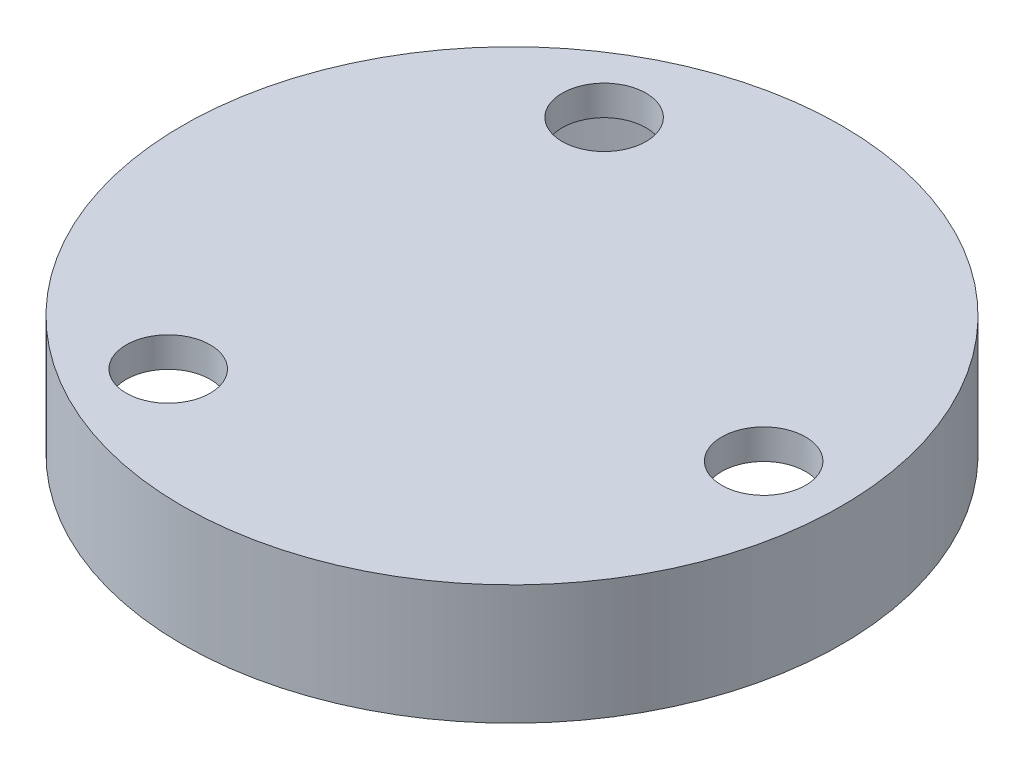
ISO-10303-21;
HEADER;
FILE_DESCRIPTION(('STEP AP214'),'2;1');
FILE_NAME('part.step','',(''),(''),'','','');
FILE_SCHEMA(('AUTOMOTIVE_DESIGN { 1 0 10303 214 1 1 1 1 }'));
ENDSEC;
DATA;
#1=APPLICATION_CONTEXT('core data for automotive mechanical design processes');
#2=APPLICATION_PROTOCOL_DEFINITION('international standard','automotive_design',2000,#1);
#3=PRODUCT_CONTEXT('',#1,'mechanical');
#4=PRODUCT('Part','Part','',(#3));
#5=PRODUCT_RELATED_PRODUCT_CATEGORY('part','',(#4));
#6=PRODUCT_DEFINITION_FORMATION('','',#4);
#7=PRODUCT_DEFINITION_CONTEXT('part definition',#1,'design');
#8=PRODUCT_DEFINITION('design','',#6,#7);
#9=PRODUCT_DEFINITION_SHAPE('','',#8);
#10=(LENGTH_UNIT() NAMED_UNIT(*) SI_UNIT(.MILLI.,.METRE.));
#11=(NAMED_UNIT(*) PLANE_ANGLE_UNIT() SI_UNIT($,.RADIAN.));
#12=(NAMED_UNIT(*) SI_UNIT($,.STERADIAN.) SOLID_ANGLE_UNIT());
#13=UNCERTAINTY_MEASURE_WITH_UNIT(LENGTH_MEASURE(1.E-05),#10,'distance_accuracy_value','');
#14=(GEOMETRIC_REPRESENTATION_CONTEXT(3) GLOBAL_UNCERTAINTY_ASSIGNED_CONTEXT((#13)) GLOBAL_UNIT_ASSIGNED_CONTEXT((#10,
#11,#12)) REPRESENTATION_CONTEXT('',''));
#15=CARTESIAN_POINT('',(0.,0.,0.));
#16=DIRECTION('',(0.,0.,1.));
#17=DIRECTION('',(1.,0.,0.));
#18=AXIS2_PLACEMENT_3D('',#15,#16,#17);
#19=CARTESIAN_POINT('',(0.,20.,0.));
#20=DIRECTION('',(0.,-1.,0.));
#21=DIRECTION('',(0.,0.,-1.));
#22=AXIS2_PLACEMENT_3D('',#19,#20,#21);
#23=CYLINDRICAL_SURFACE('',#22,55.);
#24=CARTESIAN_POINT('',(0.,20.,0.));
#25=DIRECTION('',(0.,1.,0.));
#26=DIRECTION('',(0.,0.,1.));
#27=AXIS2_PLACEMENT_3D('',#24,#25,#26);
#28=CIRCLE('',#27,55.);
#29=CARTESIAN_POINT('',(0.,20.,55.));
#30=VERTEX_POINT('',#29);
#31=EDGE_CURVE('E10',#30,#30,#28,.T.);
#32=ORIENTED_EDGE('',*,*,#31,.F.);
#33=EDGE_LOOP('',(#32));
#34=FACE_BOUND('',#33,.T.);
#35=CARTESIAN_POINT('',(0.,0.,0.));
#36=DIRECTION('',(0.,1.,0.));
#37=DIRECTION('',(0.,0.,1.));
#38=AXIS2_PLACEMENT_3D('',#35,#36,#37);
#39=CIRCLE('',#38,55.);
#40=CARTESIAN_POINT('',(0.,0.,55.));
#41=VERTEX_POINT('',#40);
#42=EDGE_CURVE('E51',#41,#41,#39,.T.);
#43=ORIENTED_EDGE('',*,*,#42,.T.);
#44=EDGE_LOOP('',(#43));
#45=FACE_BOUND('',#44,.T.);
#46=ADVANCED_FACE('F43',(#34,#45),#23,.T.);
#47=CARTESIAN_POINT('',(0.,20.,0.));
#48=DIRECTION('',(0.,1.,0.));
#49=DIRECTION('',(0.,0.,1.));
#50=AXIS2_PLACEMENT_3D('',#47,#48,#49);
#51=PLANE('',#50);
#52=CARTESIAN_POINT('',(42.,20.,0.));
#53=DIRECTION('',(0.,1.,0.));
#54=DIRECTION('',(0.,0.,1.));
#55=AXIS2_PLACEMENT_3D('',#52,#53,#54);
#56=CIRCLE('',#55,6.99999999999999);
#57=CARTESIAN_POINT('',(42.,20.,6.99999999999999));
#58=VERTEX_POINT('',#57);
#59=EDGE_CURVE('E83',#58,#58,#56,.T.);
#60=ORIENTED_EDGE('',*,*,#59,.F.);
#61=EDGE_LOOP('',(#60));
#62=FACE_BOUND('',#61,.T.);
#63=CARTESIAN_POINT('',(-21.0000000000002,20.,-36.3730669589463));
#64=DIRECTION('',(0.,1.,0.));
#65=DIRECTION('',(0.,0.,1.));
#66=AXIS2_PLACEMENT_3D('',#63,#64,#65);
#67=CIRCLE('',#66,6.99999999999999);
#68=CARTESIAN_POINT('',(-21.0000000000002,20.,-29.3730669589463));
#69=VERTEX_POINT('',#68);
#70=EDGE_CURVE('E70',#69,#69,#67,.T.);
#71=ORIENTED_EDGE('',*,*,#70,.F.);
#72=EDGE_LOOP('',(#71));
#73=FACE_BOUND('',#72,.T.);
#74=CARTESIAN_POINT('',(-20.9999999999996,20.,36.3730669589466));
#75=DIRECTION('',(0.,1.,0.));
#76=DIRECTION('',(0.,0.,1.));
#77=AXIS2_PLACEMENT_3D('',#74,#75,#76);
#78=CIRCLE('',#77,6.99999999999999);
#79=CARTESIAN_POINT('',(-20.9999999999996,20.,43.3730669589466));
#80=VERTEX_POINT('',#79);
#81=EDGE_CURVE('E66',#80,#80,#78,.T.);
#82=ORIENTED_EDGE('',*,*,#81,.F.);
#83=EDGE_LOOP('',(#82));
#84=FACE_BOUND('',#83,.T.);
#85=ORIENTED_EDGE('',*,*,#31,.T.);
#86=EDGE_LOOP('',(#85));
#87=FACE_BOUND('',#86,.T.);
#88=ADVANCED_FACE('F98',(#62,#73,#84,#87),#51,.T.);
#89=CARTESIAN_POINT('',(0.,0.,0.));
#90=DIRECTION('',(0.,1.,0.));
#91=DIRECTION('',(0.,0.,1.));
#92=AXIS2_PLACEMENT_3D('',#89,#90,#91);
#93=PLANE('',#92);
#94=CARTESIAN_POINT('',(0.,0.,0.));
#95=DIRECTION('',(0.,-1.,0.));
#96=DIRECTION('',(0.,0.,-1.));
#97=AXIS2_PLACEMENT_3D('',#94,#95,#96);
#98=CIRCLE('',#97,50.);
#99=CARTESIAN_POINT('',(0.,0.,-50.));
#100=VERTEX_POINT('',#99);
#101=EDGE_CURVE('E60',#100,#100,#98,.T.);
#102=ORIENTED_EDGE('',*,*,#101,.F.);
#103=EDGE_LOOP('',(#102));
#104=FACE_BOUND('',#103,.T.);
#105=ORIENTED_EDGE('',*,*,#42,.F.);
#106=EDGE_LOOP('',(#105));
#107=FACE_BOUND('',#106,.T.);
#108=ADVANCED_FACE('F95',(#104,#107),#93,.F.);
#109=CARTESIAN_POINT('',(0.,15.,0.));
#110=DIRECTION('',(0.,-1.,0.));
#111=DIRECTION('',(0.,0.,-1.));
#112=AXIS2_PLACEMENT_3D('',#109,#110,#111);
#113=CYLINDRICAL_SURFACE('',#112,50.);
#114=CARTESIAN_POINT('',(0.,15.,0.));
#115=DIRECTION('',(0.,-1.,0.));
#116=DIRECTION('',(0.,0.,-1.));
#117=AXIS2_PLACEMENT_3D('',#114,#115,#116);
#118=CIRCLE('',#117,50.);
#119=CARTESIAN_POINT('',(0.,15.,-50.));
#120=VERTEX_POINT('',#119);
#121=EDGE_CURVE('E57',#120,#120,#118,.T.);
#122=ORIENTED_EDGE('',*,*,#121,.F.);
#123=EDGE_LOOP('',(#122));
#124=FACE_BOUND('',#123,.T.);
#125=ORIENTED_EDGE('',*,*,#101,.T.);
#126=EDGE_LOOP('',(#125));
#127=FACE_BOUND('',#126,.T.);
#128=ADVANCED_FACE('F93',(#124,#127),#113,.F.);
#129=CARTESIAN_POINT('',(0.,15.,0.));
#130=DIRECTION('',(0.,-1.,0.));
#131=DIRECTION('',(0.,0.,-1.));
#132=AXIS2_PLACEMENT_3D('',#129,#130,#131);
#133=PLANE('',#132);
#134=CARTESIAN_POINT('',(42.,15.,0.));
#135=DIRECTION('',(0.,-1.,0.));
#136=DIRECTION('',(0.,0.,-1.));
#137=AXIS2_PLACEMENT_3D('',#134,#135,#136);
#138=CIRCLE('',#137,6.99999999999999);
#139=CARTESIAN_POINT('',(42.,15.,-6.99999999999999));
#140=VERTEX_POINT('',#139);
#141=EDGE_CURVE('E46',#140,#140,#138,.T.);
#142=ORIENTED_EDGE('',*,*,#141,.F.);
#143=EDGE_LOOP('',(#142));
#144=FACE_BOUND('',#143,.T.);
#145=CARTESIAN_POINT('',(-21.0000000000002,15.,-36.3730669589463));
#146=DIRECTION('',(0.,-1.,0.));
#147=DIRECTION('',(0.,0.,-1.));
#148=AXIS2_PLACEMENT_3D('',#145,#146,#147);
#149=CIRCLE('',#148,6.99999999999999);
#150=CARTESIAN_POINT('',(-21.0000000000002,15.,-43.3730669589463));
#151=VERTEX_POINT('',#150);
#152=EDGE_CURVE('E67',#151,#151,#149,.T.);
#153=ORIENTED_EDGE('',*,*,#152,.F.);
#154=EDGE_LOOP('',(#153));
#155=FACE_BOUND('',#154,.T.);
#156=CARTESIAN_POINT('',(-20.9999999999996,15.,36.3730669589466));
#157=DIRECTION('',(0.,-1.,0.));
#158=DIRECTION('',(0.,0.,-1.));
#159=AXIS2_PLACEMENT_3D('',#156,#157,#158);
#160=CIRCLE('',#159,6.99999999999999);
#161=CARTESIAN_POINT('',(-20.9999999999996,15.,29.3730669589466));
#162=VERTEX_POINT('',#161);
#163=EDGE_CURVE('E63',#162,#162,#160,.T.);
#164=ORIENTED_EDGE('',*,*,#163,.F.);
#165=EDGE_LOOP('',(#164));
#166=FACE_BOUND('',#165,.T.);
#167=ORIENTED_EDGE('',*,*,#121,.T.);
#168=EDGE_LOOP('',(#167));
#169=FACE_BOUND('',#168,.T.);
#170=ADVANCED_FACE('F116',(#144,#155,#166,#169),#133,.T.);
#171=CARTESIAN_POINT('',(-20.9999999999996,20.,36.3730669589466));
#172=DIRECTION('',(0.,1.,0.));
#173=DIRECTION('',(0.,0.,1.));
#174=AXIS2_PLACEMENT_3D('',#171,#172,#173);
#175=CYLINDRICAL_SURFACE('',#174,6.99999999999999);
#176=ORIENTED_EDGE('',*,*,#163,.T.);
#177=EDGE_LOOP('',(#176));
#178=FACE_BOUND('',#177,.T.);
#179=ORIENTED_EDGE('',*,*,#81,.T.);
#180=EDGE_LOOP('',(#179));
#181=FACE_BOUND('',#180,.T.);
#182=ADVANCED_FACE('F119',(#178,#181),#175,.F.);
#183=CARTESIAN_POINT('',(-21.0000000000002,20.,-36.3730669589463));
#184=DIRECTION('',(0.,1.,0.));
#185=DIRECTION('',(0.,0.,1.));
#186=AXIS2_PLACEMENT_3D('',#183,#184,#185);
#187=CYLINDRICAL_SURFACE('',#186,6.99999999999999);
#188=ORIENTED_EDGE('',*,*,#152,.T.);
#189=EDGE_LOOP('',(#188));
#190=FACE_BOUND('',#189,.T.);
#191=ORIENTED_EDGE('',*,*,#70,.T.);
#192=EDGE_LOOP('',(#191));
#193=FACE_BOUND('',#192,.T.);
#194=ADVANCED_FACE('F123',(#190,#193),#187,.F.);
#195=CARTESIAN_POINT('',(42.,20.,0.));
#196=DIRECTION('',(0.,1.,0.));
#197=DIRECTION('',(0.,0.,1.));
#198=AXIS2_PLACEMENT_3D('',#195,#196,#197);
#199=CYLINDRICAL_SURFACE('',#198,6.99999999999999);
#200=ORIENTED_EDGE('',*,*,#141,.T.);
#201=EDGE_LOOP('',(#200));
#202=FACE_BOUND('',#201,.T.);
#203=ORIENTED_EDGE('',*,*,#59,.T.);
#204=EDGE_LOOP('',(#203));
#205=FACE_BOUND('',#204,.T.);
#206=ADVANCED_FACE('F127',(#202,#205),#199,.F.);
#207=CLOSED_SHELL('',(#46,#88,#108,#128,#170,#182,#194,#206));
#208=MANIFOLD_SOLID_BREP('B2',#207);
#209=ADVANCED_BREP_SHAPE_REPRESENTATION('',(#18,#208),#14);
#210=SHAPE_DEFINITION_REPRESENTATION(#9,#209);
ENDSEC;
END-ISO-10303-21;
